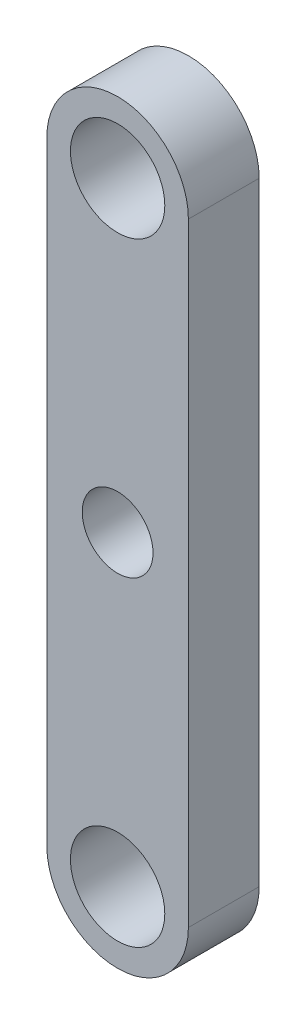
ISO-10303-21;
HEADER;
FILE_DESCRIPTION(('STEP AP214'),'2;1');
FILE_NAME('part.step','',(''),(''),'','','');
FILE_SCHEMA(('AUTOMOTIVE_DESIGN { 1 0 10303 214 1 1 1 1 }'));
ENDSEC;
DATA;
#1=APPLICATION_CONTEXT('core data for automotive mechanical design processes');
#2=APPLICATION_PROTOCOL_DEFINITION('international standard','automotive_design',2000,#1);
#3=PRODUCT_CONTEXT('',#1,'mechanical');
#4=PRODUCT('Part','Part','',(#3));
#5=PRODUCT_RELATED_PRODUCT_CATEGORY('part','',(#4));
#6=PRODUCT_DEFINITION_FORMATION('','',#4);
#7=PRODUCT_DEFINITION_CONTEXT('part definition',#1,'design');
#8=PRODUCT_DEFINITION('design','',#6,#7);
#9=PRODUCT_DEFINITION_SHAPE('','',#8);
#10=(LENGTH_UNIT() NAMED_UNIT(*) SI_UNIT(.MILLI.,.METRE.));
#11=(NAMED_UNIT(*) PLANE_ANGLE_UNIT() SI_UNIT($,.RADIAN.));
#12=(NAMED_UNIT(*) SI_UNIT($,.STERADIAN.) SOLID_ANGLE_UNIT());
#13=UNCERTAINTY_MEASURE_WITH_UNIT(LENGTH_MEASURE(1.E-05),#10,'distance_accuracy_value','');
#14=(GEOMETRIC_REPRESENTATION_CONTEXT(3) GLOBAL_UNCERTAINTY_ASSIGNED_CONTEXT((#13)) GLOBAL_UNIT_ASSIGNED_CONTEXT((#10,
#11,#12)) REPRESENTATION_CONTEXT('',''));
#15=CARTESIAN_POINT('',(0.,0.,0.));
#16=DIRECTION('',(0.,0.,1.));
#17=DIRECTION('',(1.,0.,0.));
#18=AXIS2_PLACEMENT_3D('',#15,#16,#17);
#19=CARTESIAN_POINT('',(0.,13.,3.));
#20=DIRECTION('',(0.,0.,1.));
#21=DIRECTION('',(1.,0.,0.));
#22=AXIS2_PLACEMENT_3D('',#19,#20,#21);
#23=PLANE('',#22);
#24=CARTESIAN_POINT('',(0.,13.,3.));
#25=DIRECTION('',(0.,0.,1.));
#26=DIRECTION('',(1.,0.,0.));
#27=AXIS2_PLACEMENT_3D('',#24,#25,#26);
#28=CIRCLE('',#27,2.);
#29=CARTESIAN_POINT('',(2.00000000000001,13.,3.));
#30=VERTEX_POINT('',#29);
#31=EDGE_CURVE('E166',#30,#30,#28,.T.);
#32=ORIENTED_EDGE('',*,*,#31,.F.);
#33=EDGE_LOOP('',(#32));
#34=FACE_BOUND('',#33,.T.);
#35=CARTESIAN_POINT('',(0.,-13.,3.));
#36=DIRECTION('',(0.,0.,1.));
#37=DIRECTION('',(1.,0.,0.));
#38=AXIS2_PLACEMENT_3D('',#35,#36,#37);
#39=CIRCLE('',#38,2.);
#40=CARTESIAN_POINT('',(2.00000000000001,-13.,3.));
#41=VERTEX_POINT('',#40);
#42=EDGE_CURVE('E156',#41,#41,#39,.T.);
#43=ORIENTED_EDGE('',*,*,#42,.F.);
#44=EDGE_LOOP('',(#43));
#45=FACE_BOUND('',#44,.T.);
#46=CARTESIAN_POINT('',(0.,0.,3.));
#47=DIRECTION('',(0.,0.,1.));
#48=DIRECTION('',(1.,0.,0.));
#49=AXIS2_PLACEMENT_3D('',#46,#47,#48);
#50=CIRCLE('',#49,1.5);
#51=CARTESIAN_POINT('',(1.5,0.,3.));
#52=VERTEX_POINT('',#51);
#53=EDGE_CURVE('E145',#52,#52,#50,.T.);
#54=ORIENTED_EDGE('',*,*,#53,.F.);
#55=EDGE_LOOP('',(#54));
#56=FACE_BOUND('',#55,.T.);
#57=CARTESIAN_POINT('',(0.,13.,3.));
#58=DIRECTION('',(0.,0.,1.));
#59=DIRECTION('',(1.,0.,0.));
#60=AXIS2_PLACEMENT_3D('',#57,#58,#59);
#61=CIRCLE('',#60,3.);
#62=CARTESIAN_POINT('',(3.00000000000001,13.,3.));
#63=VERTEX_POINT('',#62);
#64=CARTESIAN_POINT('',(-2.99999999999999,13.,3.));
#65=VERTEX_POINT('',#64);
#66=EDGE_CURVE('E128',#63,#65,#61,.T.);
#67=ORIENTED_EDGE('',*,*,#66,.T.);
#68=DIRECTION('',(0.,-1.,0.));
#69=VECTOR('',#68,1.);
#70=CARTESIAN_POINT('',(-2.99999999999999,13.,3.));
#71=LINE('',#70,#69);
#72=CARTESIAN_POINT('',(-2.99999999999999,-13.,3.));
#73=VERTEX_POINT('',#72);
#74=EDGE_CURVE('E122',#65,#73,#71,.T.);
#75=ORIENTED_EDGE('',*,*,#74,.T.);
#76=CARTESIAN_POINT('',(0.,-13.,3.));
#77=DIRECTION('',(0.,0.,1.));
#78=DIRECTION('',(1.,0.,0.));
#79=AXIS2_PLACEMENT_3D('',#76,#77,#78);
#80=CIRCLE('',#79,3.);
#81=CARTESIAN_POINT('',(3.00000000000001,-13.,3.));
#82=VERTEX_POINT('',#81);
#83=EDGE_CURVE('E127',#73,#82,#80,.T.);
#84=ORIENTED_EDGE('',*,*,#83,.T.);
#85=DIRECTION('',(0.,-1.,0.));
#86=VECTOR('',#85,1.);
#87=CARTESIAN_POINT('',(3.00000000000001,13.,3.));
#88=LINE('',#87,#86);
#89=EDGE_CURVE('E138',#63,#82,#88,.T.);
#90=ORIENTED_EDGE('',*,*,#89,.F.);
#91=EDGE_LOOP('',(#67,#75,#84,#90));
#92=FACE_BOUND('',#91,.T.);
#93=ADVANCED_FACE('F77',(#34,#45,#56,#92),#23,.T.);
#94=CARTESIAN_POINT('',(0.,13.,0.));
#95=DIRECTION('',(0.,0.,1.));
#96=DIRECTION('',(1.,0.,0.));
#97=AXIS2_PLACEMENT_3D('',#94,#95,#96);
#98=PLANE('',#97);
#99=CARTESIAN_POINT('',(0.,13.,0.));
#100=DIRECTION('',(0.,0.,1.));
#101=DIRECTION('',(1.,0.,0.));
#102=AXIS2_PLACEMENT_3D('',#99,#100,#101);
#103=CIRCLE('',#102,2.);
#104=CARTESIAN_POINT('',(2.00000000000001,13.,0.));
#105=VERTEX_POINT('',#104);
#106=EDGE_CURVE('E81',#105,#105,#103,.T.);
#107=ORIENTED_EDGE('',*,*,#106,.T.);
#108=EDGE_LOOP('',(#107));
#109=FACE_BOUND('',#108,.T.);
#110=CARTESIAN_POINT('',(0.,-13.,0.));
#111=DIRECTION('',(0.,0.,1.));
#112=DIRECTION('',(1.,0.,0.));
#113=AXIS2_PLACEMENT_3D('',#110,#111,#112);
#114=CIRCLE('',#113,2.);
#115=CARTESIAN_POINT('',(2.00000000000001,-13.,0.));
#116=VERTEX_POINT('',#115);
#117=EDGE_CURVE('E153',#116,#116,#114,.T.);
#118=ORIENTED_EDGE('',*,*,#117,.T.);
#119=EDGE_LOOP('',(#118));
#120=FACE_BOUND('',#119,.T.);
#121=CARTESIAN_POINT('',(0.,0.,0.));
#122=DIRECTION('',(0.,0.,1.));
#123=DIRECTION('',(1.,0.,0.));
#124=AXIS2_PLACEMENT_3D('',#121,#122,#123);
#125=CIRCLE('',#124,1.5);
#126=CARTESIAN_POINT('',(1.5,0.,0.));
#127=VERTEX_POINT('',#126);
#128=EDGE_CURVE('E155',#127,#127,#125,.T.);
#129=ORIENTED_EDGE('',*,*,#128,.T.);
#130=EDGE_LOOP('',(#129));
#131=FACE_BOUND('',#130,.T.);
#132=CARTESIAN_POINT('',(0.,13.,0.));
#133=DIRECTION('',(0.,0.,1.));
#134=DIRECTION('',(1.,0.,0.));
#135=AXIS2_PLACEMENT_3D('',#132,#133,#134);
#136=CIRCLE('',#135,3.);
#137=CARTESIAN_POINT('',(3.00000000000001,13.,0.));
#138=VERTEX_POINT('',#137);
#139=CARTESIAN_POINT('',(-2.99999999999999,13.,0.));
#140=VERTEX_POINT('',#139);
#141=EDGE_CURVE('E143',#138,#140,#136,.T.);
#142=ORIENTED_EDGE('',*,*,#141,.F.);
#143=DIRECTION('',(0.,-1.,0.));
#144=VECTOR('',#143,1.);
#145=CARTESIAN_POINT('',(3.00000000000001,13.,0.));
#146=LINE('',#145,#144);
#147=CARTESIAN_POINT('',(3.00000000000001,-13.,0.));
#148=VERTEX_POINT('',#147);
#149=EDGE_CURVE('E149',#138,#148,#146,.T.);
#150=ORIENTED_EDGE('',*,*,#149,.T.);
#151=CARTESIAN_POINT('',(0.,-13.,0.));
#152=DIRECTION('',(0.,0.,1.));
#153=DIRECTION('',(1.,0.,0.));
#154=AXIS2_PLACEMENT_3D('',#151,#152,#153);
#155=CIRCLE('',#154,3.);
#156=CARTESIAN_POINT('',(-2.99999999999999,-13.,0.));
#157=VERTEX_POINT('',#156);
#158=EDGE_CURVE('E147',#157,#148,#155,.T.);
#159=ORIENTED_EDGE('',*,*,#158,.F.);
#160=DIRECTION('',(0.,-1.,0.));
#161=VECTOR('',#160,1.);
#162=CARTESIAN_POINT('',(-2.99999999999999,13.,0.));
#163=LINE('',#162,#161);
#164=EDGE_CURVE('E133',#140,#157,#163,.T.);
#165=ORIENTED_EDGE('',*,*,#164,.F.);
#166=EDGE_LOOP('',(#142,#150,#159,#165));
#167=FACE_BOUND('',#166,.T.);
#168=ADVANCED_FACE('F176',(#109,#120,#131,#167),#98,.F.);
#169=CARTESIAN_POINT('',(0.,13.,3.));
#170=DIRECTION('',(0.,0.,-1.));
#171=DIRECTION('',(-1.,0.,0.));
#172=AXIS2_PLACEMENT_3D('',#169,#170,#171);
#173=CYLINDRICAL_SURFACE('',#172,3.);
#174=ORIENTED_EDGE('',*,*,#141,.T.);
#175=DIRECTION('',(0.,0.,-1.));
#176=VECTOR('',#175,1.);
#177=CARTESIAN_POINT('',(-2.99999999999999,13.,3.));
#178=LINE('',#177,#176);
#179=EDGE_CURVE('E12',#65,#140,#178,.T.);
#180=ORIENTED_EDGE('',*,*,#179,.F.);
#181=ORIENTED_EDGE('',*,*,#66,.F.);
#182=DIRECTION('',(0.,0.,-1.));
#183=VECTOR('',#182,1.);
#184=CARTESIAN_POINT('',(3.00000000000001,13.,3.));
#185=LINE('',#184,#183);
#186=EDGE_CURVE('E96',#63,#138,#185,.T.);
#187=ORIENTED_EDGE('',*,*,#186,.T.);
#188=EDGE_LOOP('',(#174,#180,#181,#187));
#189=FACE_BOUND('',#188,.T.);
#190=ADVANCED_FACE('F79',(#189),#173,.T.);
#191=CARTESIAN_POINT('',(-2.99999999999999,13.,3.));
#192=DIRECTION('',(1.,0.,0.));
#193=DIRECTION('',(0.,0.,-1.));
#194=AXIS2_PLACEMENT_3D('',#191,#192,#193);
#195=PLANE('',#194);
#196=ORIENTED_EDGE('',*,*,#164,.T.);
#197=DIRECTION('',(0.,0.,-1.));
#198=VECTOR('',#197,1.);
#199=CARTESIAN_POINT('',(-2.99999999999999,-13.,3.));
#200=LINE('',#199,#198);
#201=EDGE_CURVE('E87',#73,#157,#200,.T.);
#202=ORIENTED_EDGE('',*,*,#201,.F.);
#203=ORIENTED_EDGE('',*,*,#74,.F.);
#204=ORIENTED_EDGE('',*,*,#179,.T.);
#205=EDGE_LOOP('',(#196,#202,#203,#204));
#206=FACE_BOUND('',#205,.T.);
#207=ADVANCED_FACE('F132',(#206),#195,.F.);
#208=CARTESIAN_POINT('',(0.,-13.,3.));
#209=DIRECTION('',(0.,0.,-1.));
#210=DIRECTION('',(-1.,0.,0.));
#211=AXIS2_PLACEMENT_3D('',#208,#209,#210);
#212=CYLINDRICAL_SURFACE('',#211,3.);
#213=ORIENTED_EDGE('',*,*,#158,.T.);
#214=DIRECTION('',(0.,0.,-1.));
#215=VECTOR('',#214,1.);
#216=CARTESIAN_POINT('',(3.00000000000001,-13.,3.));
#217=LINE('',#216,#215);
#218=EDGE_CURVE('E111',#82,#148,#217,.T.);
#219=ORIENTED_EDGE('',*,*,#218,.F.);
#220=ORIENTED_EDGE('',*,*,#83,.F.);
#221=ORIENTED_EDGE('',*,*,#201,.T.);
#222=EDGE_LOOP('',(#213,#219,#220,#221));
#223=FACE_BOUND('',#222,.T.);
#224=ADVANCED_FACE('F137',(#223),#212,.T.);
#225=CARTESIAN_POINT('',(3.00000000000001,13.,3.));
#226=DIRECTION('',(1.,0.,0.));
#227=DIRECTION('',(0.,1.,0.));
#228=AXIS2_PLACEMENT_3D('',#225,#226,#227);
#229=PLANE('',#228);
#230=ORIENTED_EDGE('',*,*,#149,.F.);
#231=ORIENTED_EDGE('',*,*,#186,.F.);
#232=ORIENTED_EDGE('',*,*,#89,.T.);
#233=ORIENTED_EDGE('',*,*,#218,.T.);
#234=EDGE_LOOP('',(#230,#231,#232,#233));
#235=FACE_BOUND('',#234,.T.);
#236=ADVANCED_FACE('F189',(#235),#229,.T.);
#237=CARTESIAN_POINT('',(0.,0.,3.));
#238=DIRECTION('',(0.,0.,-1.));
#239=DIRECTION('',(-1.,0.,0.));
#240=AXIS2_PLACEMENT_3D('',#237,#238,#239);
#241=CYLINDRICAL_SURFACE('',#240,1.5);
#242=ORIENTED_EDGE('',*,*,#53,.T.);
#243=EDGE_LOOP('',(#242));
#244=FACE_BOUND('',#243,.T.);
#245=ORIENTED_EDGE('',*,*,#128,.F.);
#246=EDGE_LOOP('',(#245));
#247=FACE_BOUND('',#246,.T.);
#248=ADVANCED_FACE('F172',(#244,#247),#241,.F.);
#249=CARTESIAN_POINT('',(0.,-13.,-7.));
#250=DIRECTION('',(0.,0.,1.));
#251=DIRECTION('',(1.,0.,0.));
#252=AXIS2_PLACEMENT_3D('',#249,#250,#251);
#253=CYLINDRICAL_SURFACE('',#252,2.);
#254=ORIENTED_EDGE('',*,*,#42,.T.);
#255=EDGE_LOOP('',(#254));
#256=FACE_BOUND('',#255,.T.);
#257=ORIENTED_EDGE('',*,*,#117,.F.);
#258=EDGE_LOOP('',(#257));
#259=FACE_BOUND('',#258,.T.);
#260=ADVANCED_FACE('F212',(#256,#259),#253,.F.);
#261=CARTESIAN_POINT('',(0.,13.,-7.));
#262=DIRECTION('',(0.,0.,1.));
#263=DIRECTION('',(1.,0.,0.));
#264=AXIS2_PLACEMENT_3D('',#261,#262,#263);
#265=CYLINDRICAL_SURFACE('',#264,2.);
#266=ORIENTED_EDGE('',*,*,#31,.T.);
#267=EDGE_LOOP('',(#266));
#268=FACE_BOUND('',#267,.T.);
#269=ORIENTED_EDGE('',*,*,#106,.F.);
#270=EDGE_LOOP('',(#269));
#271=FACE_BOUND('',#270,.T.);
#272=ADVANCED_FACE('F217',(#268,#271),#265,.F.);
#273=CLOSED_SHELL('',(#93,#168,#190,#207,#224,#236,#248,#260,#272));
#274=MANIFOLD_SOLID_BREP('B2',#273);
#275=ADVANCED_BREP_SHAPE_REPRESENTATION('',(#18,#274),#14);
#276=SHAPE_DEFINITION_REPRESENTATION(#9,#275);
ENDSEC;
END-ISO-10303-21;
